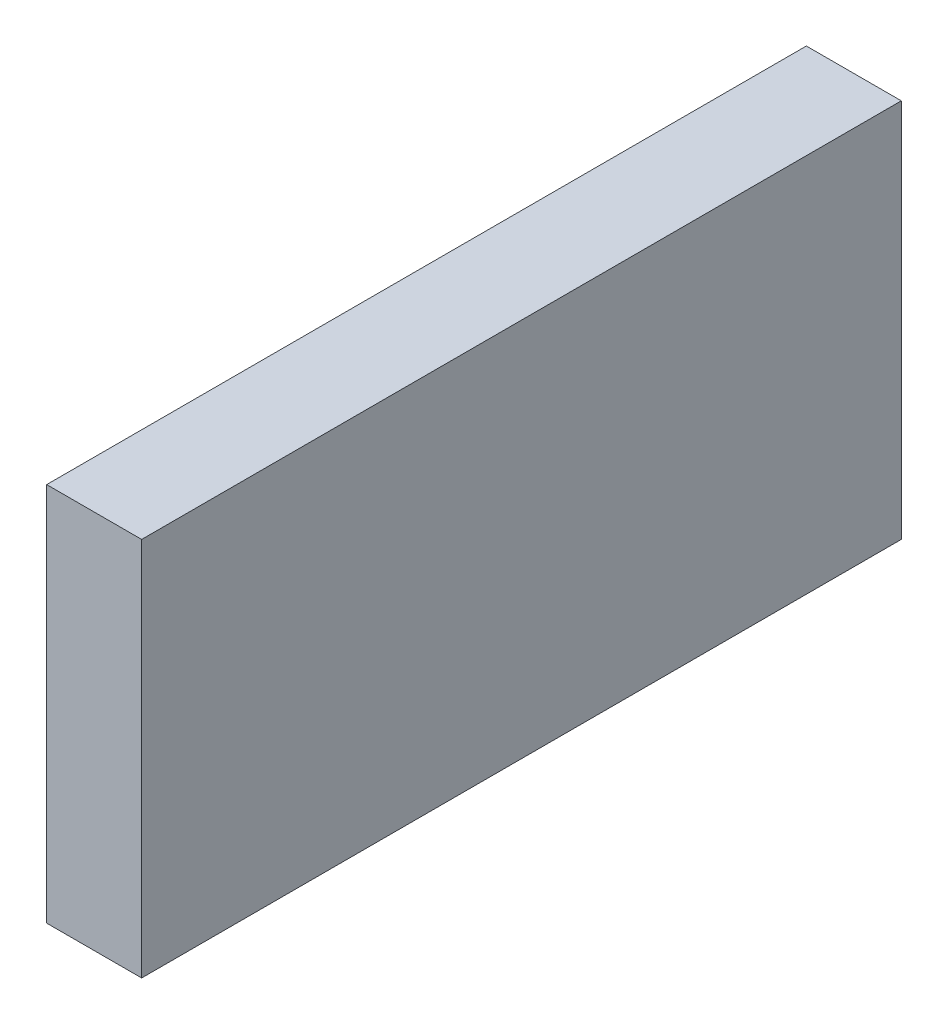
ISO-10303-21;
HEADER;
FILE_DESCRIPTION(('STEP AP214'),'2;1');
FILE_NAME('part.step','',(''),(''),'','','');
FILE_SCHEMA(('AUTOMOTIVE_DESIGN { 1 0 10303 214 1 1 1 1 }'));
ENDSEC;
DATA;
#1=APPLICATION_CONTEXT('core data for automotive mechanical design processes');
#2=APPLICATION_PROTOCOL_DEFINITION('international standard','automotive_design',2000,#1);
#3=PRODUCT_CONTEXT('',#1,'mechanical');
#4=PRODUCT('Part','Part','',(#3));
#5=PRODUCT_RELATED_PRODUCT_CATEGORY('part','',(#4));
#6=PRODUCT_DEFINITION_FORMATION('','',#4);
#7=PRODUCT_DEFINITION_CONTEXT('part definition',#1,'design');
#8=PRODUCT_DEFINITION('design','',#6,#7);
#9=PRODUCT_DEFINITION_SHAPE('','',#8);
#10=(LENGTH_UNIT() NAMED_UNIT(*) SI_UNIT(.MILLI.,.METRE.));
#11=(NAMED_UNIT(*) PLANE_ANGLE_UNIT() SI_UNIT($,.RADIAN.));
#12=(NAMED_UNIT(*) SI_UNIT($,.STERADIAN.) SOLID_ANGLE_UNIT());
#13=UNCERTAINTY_MEASURE_WITH_UNIT(LENGTH_MEASURE(1.E-05),#10,'distance_accuracy_value','');
#14=(GEOMETRIC_REPRESENTATION_CONTEXT(3) GLOBAL_UNCERTAINTY_ASSIGNED_CONTEXT((#13)) GLOBAL_UNIT_ASSIGNED_CONTEXT((#10,
#11,#12)) REPRESENTATION_CONTEXT('',''));
#15=CARTESIAN_POINT('',(0.,0.,0.));
#16=DIRECTION('',(0.,0.,1.));
#17=DIRECTION('',(1.,0.,0.));
#18=AXIS2_PLACEMENT_3D('',#15,#16,#17);
#19=CARTESIAN_POINT('',(0.0224113445720568,6.,-3.39538777784212));
#20=DIRECTION('',(0.,0.,1.));
#21=DIRECTION('',(1.,0.,0.));
#22=AXIS2_PLACEMENT_3D('',#19,#20,#21);
#23=PLANE('',#22);
#24=DIRECTION('',(-1.,0.,0.));
#25=VECTOR('',#24,1.);
#26=CARTESIAN_POINT('',(0.0224113445720568,0.,-3.39538777784212));
#27=LINE('',#26,#25);
#28=CARTESIAN_POINT('',(0.0224113445720568,0.,-3.39538777784212));
#29=VERTEX_POINT('',#28);
#30=CARTESIAN_POINT('',(-1.47758865542794,0.,-3.39538777784212));
#31=VERTEX_POINT('',#30);
#32=EDGE_CURVE('E96',#29,#31,#27,.T.);
#33=ORIENTED_EDGE('',*,*,#32,.T.);
#34=DIRECTION('',(0.,-1.,0.));
#35=VECTOR('',#34,1.);
#36=CARTESIAN_POINT('',(-1.47758865542794,6.,-3.39538777784212));
#37=LINE('',#36,#35);
#38=CARTESIAN_POINT('',(-1.47758865542794,6.,-3.39538777784212));
#39=VERTEX_POINT('',#38);
#40=EDGE_CURVE('E11',#39,#31,#37,.T.);
#41=ORIENTED_EDGE('',*,*,#40,.F.);
#42=DIRECTION('',(-1.,0.,0.));
#43=VECTOR('',#42,1.);
#44=CARTESIAN_POINT('',(0.0224113445720568,6.,-3.39538777784212));
#45=LINE('',#44,#43);
#46=CARTESIAN_POINT('',(0.0224113445720568,6.,-3.39538777784212));
#47=VERTEX_POINT('',#46);
#48=EDGE_CURVE('E84',#47,#39,#45,.T.);
#49=ORIENTED_EDGE('',*,*,#48,.F.);
#50=DIRECTION('',(0.,-1.,0.));
#51=VECTOR('',#50,1.);
#52=CARTESIAN_POINT('',(0.0224113445720568,6.,-3.39538777784212));
#53=LINE('',#52,#51);
#54=EDGE_CURVE('E92',#47,#29,#53,.T.);
#55=ORIENTED_EDGE('',*,*,#54,.T.);
#56=EDGE_LOOP('',(#33,#41,#49,#55));
#57=FACE_BOUND('',#56,.T.);
#58=ADVANCED_FACE('F33',(#57),#23,.F.);
#59=CARTESIAN_POINT('',(-1.47758865542794,6.,-3.39538777784212));
#60=DIRECTION('',(1.,0.,0.));
#61=DIRECTION('',(0.,0.,-1.));
#62=AXIS2_PLACEMENT_3D('',#59,#60,#61);
#63=PLANE('',#62);
#64=DIRECTION('',(0.,0.,1.));
#65=VECTOR('',#64,1.);
#66=CARTESIAN_POINT('',(-1.47758865542794,0.,-3.39538777784212));
#67=LINE('',#66,#65);
#68=CARTESIAN_POINT('',(-1.47758865542794,0.,8.60461222215788));
#69=VERTEX_POINT('',#68);
#70=EDGE_CURVE('E88',#31,#69,#67,.T.);
#71=ORIENTED_EDGE('',*,*,#70,.T.);
#72=DIRECTION('',(0.,-1.,0.));
#73=VECTOR('',#72,1.);
#74=CARTESIAN_POINT('',(-1.47758865542794,6.,8.60461222215788));
#75=LINE('',#74,#73);
#76=CARTESIAN_POINT('',(-1.47758865542794,6.,8.60461222215788));
#77=VERTEX_POINT('',#76);
#78=EDGE_CURVE('E41',#77,#69,#75,.T.);
#79=ORIENTED_EDGE('',*,*,#78,.F.);
#80=DIRECTION('',(0.,0.,1.));
#81=VECTOR('',#80,1.);
#82=CARTESIAN_POINT('',(-1.47758865542794,6.,-3.39538777784212));
#83=LINE('',#82,#81);
#84=EDGE_CURVE('E79',#39,#77,#83,.T.);
#85=ORIENTED_EDGE('',*,*,#84,.F.);
#86=ORIENTED_EDGE('',*,*,#40,.T.);
#87=EDGE_LOOP('',(#71,#79,#85,#86));
#88=FACE_BOUND('',#87,.T.);
#89=ADVANCED_FACE('F87',(#88),#63,.F.);
#90=CARTESIAN_POINT('',(-1.47758865542794,6.,8.60461222215788));
#91=DIRECTION('',(0.,0.,-1.));
#92=DIRECTION('',(-1.,0.,0.));
#93=AXIS2_PLACEMENT_3D('',#90,#91,#92);
#94=PLANE('',#93);
#95=DIRECTION('',(1.,0.,0.));
#96=VECTOR('',#95,1.);
#97=CARTESIAN_POINT('',(-1.47758865542794,0.,8.60461222215788));
#98=LINE('',#97,#96);
#99=CARTESIAN_POINT('',(0.0224113445720568,0.,8.60461222215788));
#100=VERTEX_POINT('',#99);
#101=EDGE_CURVE('E66',#69,#100,#98,.T.);
#102=ORIENTED_EDGE('',*,*,#101,.T.);
#103=DIRECTION('',(0.,-1.,0.));
#104=VECTOR('',#103,1.);
#105=CARTESIAN_POINT('',(0.0224113445720568,6.,8.60461222215788));
#106=LINE('',#105,#104);
#107=CARTESIAN_POINT('',(0.0224113445720568,6.,8.60461222215788));
#108=VERTEX_POINT('',#107);
#109=EDGE_CURVE('E89',#108,#100,#106,.T.);
#110=ORIENTED_EDGE('',*,*,#109,.F.);
#111=DIRECTION('',(1.,0.,0.));
#112=VECTOR('',#111,1.);
#113=CARTESIAN_POINT('',(-1.47758865542794,6.,8.60461222215788));
#114=LINE('',#113,#112);
#115=EDGE_CURVE('E82',#77,#108,#114,.T.);
#116=ORIENTED_EDGE('',*,*,#115,.F.);
#117=ORIENTED_EDGE('',*,*,#78,.T.);
#118=EDGE_LOOP('',(#102,#110,#116,#117));
#119=FACE_BOUND('',#118,.T.);
#120=ADVANCED_FACE('F90',(#119),#94,.F.);
#121=CARTESIAN_POINT('',(0.0224113445720568,6.,8.60461222215788));
#122=DIRECTION('',(-1.,0.,0.));
#123=DIRECTION('',(0.,0.,1.));
#124=AXIS2_PLACEMENT_3D('',#121,#122,#123);
#125=PLANE('',#124);
#126=DIRECTION('',(0.,0.,-1.));
#127=VECTOR('',#126,1.);
#128=CARTESIAN_POINT('',(0.0224113445720568,0.,8.60461222215788));
#129=LINE('',#128,#127);
#130=EDGE_CURVE('E72',#100,#29,#129,.T.);
#131=ORIENTED_EDGE('',*,*,#130,.T.);
#132=ORIENTED_EDGE('',*,*,#54,.F.);
#133=DIRECTION('',(0.,0.,-1.));
#134=VECTOR('',#133,1.);
#135=CARTESIAN_POINT('',(0.0224113445720568,6.,8.60461222215788));
#136=LINE('',#135,#134);
#137=EDGE_CURVE('E49',#108,#47,#136,.T.);
#138=ORIENTED_EDGE('',*,*,#137,.F.);
#139=ORIENTED_EDGE('',*,*,#109,.T.);
#140=EDGE_LOOP('',(#131,#132,#138,#139));
#141=FACE_BOUND('',#140,.T.);
#142=ADVANCED_FACE('F103',(#141),#125,.F.);
#143=CARTESIAN_POINT('',(0.,6.,0.));
#144=DIRECTION('',(0.,1.,0.));
#145=DIRECTION('',(0.,0.,1.));
#146=AXIS2_PLACEMENT_3D('',#143,#144,#145);
#147=PLANE('',#146);
#148=ORIENTED_EDGE('',*,*,#48,.T.);
#149=ORIENTED_EDGE('',*,*,#84,.T.);
#150=ORIENTED_EDGE('',*,*,#115,.T.);
#151=ORIENTED_EDGE('',*,*,#137,.T.);
#152=EDGE_LOOP('',(#148,#149,#150,#151));
#153=FACE_BOUND('',#152,.T.);
#154=ADVANCED_FACE('F80',(#153),#147,.T.);
#155=CARTESIAN_POINT('',(0.,0.,0.));
#156=DIRECTION('',(0.,1.,0.));
#157=DIRECTION('',(0.,0.,1.));
#158=AXIS2_PLACEMENT_3D('',#155,#156,#157);
#159=PLANE('',#158);
#160=ORIENTED_EDGE('',*,*,#32,.F.);
#161=ORIENTED_EDGE('',*,*,#130,.F.);
#162=ORIENTED_EDGE('',*,*,#101,.F.);
#163=ORIENTED_EDGE('',*,*,#70,.F.);
#164=EDGE_LOOP('',(#160,#161,#162,#163));
#165=FACE_BOUND('',#164,.T.);
#166=ADVANCED_FACE('F106',(#165),#159,.F.);
#167=CLOSED_SHELL('',(#58,#89,#120,#142,#154,#166));
#168=MANIFOLD_SOLID_BREP('B2',#167);
#169=ADVANCED_BREP_SHAPE_REPRESENTATION('',(#18,#168),#14);
#170=SHAPE_DEFINITION_REPRESENTATION(#9,#169);
ENDSEC;
END-ISO-10303-21;
